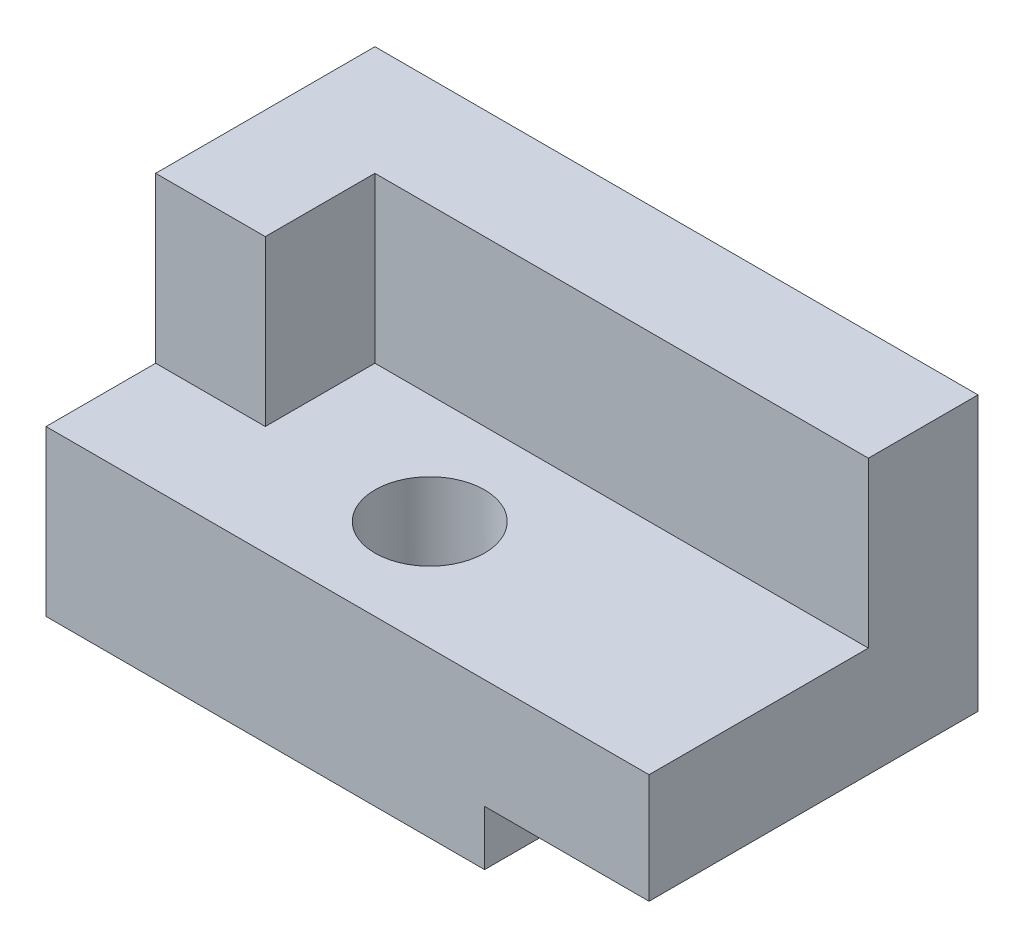
ISO-10303-21;
HEADER;
FILE_DESCRIPTION(('STEP AP214'),'2;1');
FILE_NAME('part.step','',(''),(''),'','','');
FILE_SCHEMA(('AUTOMOTIVE_DESIGN { 1 0 10303 214 1 1 1 1 }'));
ENDSEC;
DATA;
#1=APPLICATION_CONTEXT('core data for automotive mechanical design processes');
#2=APPLICATION_PROTOCOL_DEFINITION('international standard','automotive_design',2000,#1);
#3=PRODUCT_CONTEXT('',#1,'mechanical');
#4=PRODUCT('Part','Part','',(#3));
#5=PRODUCT_RELATED_PRODUCT_CATEGORY('part','',(#4));
#6=PRODUCT_DEFINITION_FORMATION('','',#4);
#7=PRODUCT_DEFINITION_CONTEXT('part definition',#1,'design');
#8=PRODUCT_DEFINITION('design','',#6,#7);
#9=PRODUCT_DEFINITION_SHAPE('','',#8);
#10=(LENGTH_UNIT() NAMED_UNIT(*) SI_UNIT(.MILLI.,.METRE.));
#11=(NAMED_UNIT(*) PLANE_ANGLE_UNIT() SI_UNIT($,.RADIAN.));
#12=(NAMED_UNIT(*) SI_UNIT($,.STERADIAN.) SOLID_ANGLE_UNIT());
#13=UNCERTAINTY_MEASURE_WITH_UNIT(LENGTH_MEASURE(1.E-05),#10,'distance_accuracy_value','');
#14=(GEOMETRIC_REPRESENTATION_CONTEXT(3) GLOBAL_UNCERTAINTY_ASSIGNED_CONTEXT((#13)) GLOBAL_UNIT_ASSIGNED_CONTEXT((#10,
#11,#12)) REPRESENTATION_CONTEXT('',''));
#15=CARTESIAN_POINT('',(0.,0.,0.));
#16=DIRECTION('',(0.,0.,1.));
#17=DIRECTION('',(1.,0.,0.));
#18=AXIS2_PLACEMENT_3D('',#15,#16,#17);
#19=CARTESIAN_POINT('',(88.9,25.4,-76.2));
#20=DIRECTION('',(0.,0.,-1.));
#21=DIRECTION('',(-1.,0.,0.));
#22=AXIS2_PLACEMENT_3D('',#19,#20,#21);
#23=PLANE('',#22);
#24=DIRECTION('',(0.,1.,0.));
#25=VECTOR('',#24,1.);
#26=CARTESIAN_POINT('',(228.6,25.4,-76.2));
#27=LINE('',#26,#25);
#28=CARTESIAN_POINT('',(228.6,38.1,-76.2));
#29=VERTEX_POINT('',#28);
#30=CARTESIAN_POINT('',(228.6,101.6,-76.2));
#31=VERTEX_POINT('',#30);
#32=EDGE_CURVE('E126',#29,#31,#27,.T.);
#33=ORIENTED_EDGE('',*,*,#32,.F.);
#34=DIRECTION('',(-1.,0.,0.));
#35=VECTOR('',#34,1.);
#36=CARTESIAN_POINT('',(88.9,38.1,-76.2));
#37=LINE('',#36,#35);
#38=CARTESIAN_POINT('',(190.5,38.1,-76.2));
#39=VERTEX_POINT('',#38);
#40=EDGE_CURVE('E116',#29,#39,#37,.T.);
#41=ORIENTED_EDGE('',*,*,#40,.T.);
#42=DIRECTION('',(0.,-1.,0.));
#43=VECTOR('',#42,1.);
#44=CARTESIAN_POINT('',(190.5,25.4,-76.2));
#45=LINE('',#44,#43);
#46=CARTESIAN_POINT('',(190.5,25.4,-76.2));
#47=VERTEX_POINT('',#46);
#48=EDGE_CURVE('E109',#39,#47,#45,.T.);
#49=ORIENTED_EDGE('',*,*,#48,.T.);
#50=DIRECTION('',(-1.,0.,0.));
#51=VECTOR('',#50,1.);
#52=CARTESIAN_POINT('',(88.9,25.4,-76.2));
#53=LINE('',#52,#51);
#54=CARTESIAN_POINT('',(88.9,25.4,-76.2));
#55=VERTEX_POINT('',#54);
#56=EDGE_CURVE('E158',#47,#55,#53,.T.);
#57=ORIENTED_EDGE('',*,*,#56,.T.);
#58=DIRECTION('',(0.,1.,0.));
#59=VECTOR('',#58,1.);
#60=CARTESIAN_POINT('',(88.9,25.4,-76.2));
#61=LINE('',#60,#59);
#62=CARTESIAN_POINT('',(88.9,101.6,-76.2));
#63=VERTEX_POINT('',#62);
#64=EDGE_CURVE('E163',#55,#63,#61,.T.);
#65=ORIENTED_EDGE('',*,*,#64,.T.);
#66=DIRECTION('',(-1.,0.,0.));
#67=VECTOR('',#66,1.);
#68=CARTESIAN_POINT('',(88.9,101.6,-76.2));
#69=LINE('',#68,#67);
#70=EDGE_CURVE('E156',#31,#63,#69,.T.);
#71=ORIENTED_EDGE('',*,*,#70,.F.);
#72=EDGE_LOOP('',(#33,#41,#49,#57,#65,#71));
#73=FACE_BOUND('',#72,.T.);
#74=ADVANCED_FACE('F34',(#73),#23,.T.);
#75=CARTESIAN_POINT('',(228.6,25.4,-76.2));
#76=DIRECTION('',(1.,0.,0.));
#77=DIRECTION('',(0.,0.,-1.));
#78=AXIS2_PLACEMENT_3D('',#75,#76,#77);
#79=PLANE('',#78);
#80=DIRECTION('',(0.,1.,0.));
#81=VECTOR('',#80,1.);
#82=CARTESIAN_POINT('',(228.6,25.4,0.));
#83=LINE('',#82,#81);
#84=CARTESIAN_POINT('',(228.6,38.1,0.));
#85=VERTEX_POINT('',#84);
#86=CARTESIAN_POINT('',(228.6,63.5,0.));
#87=VERTEX_POINT('',#86);
#88=EDGE_CURVE('E154',#85,#87,#83,.T.);
#89=ORIENTED_EDGE('',*,*,#88,.F.);
#90=DIRECTION('',(0.,0.,-1.));
#91=VECTOR('',#90,1.);
#92=CARTESIAN_POINT('',(228.6,38.1,284.042548332516));
#93=LINE('',#92,#91);
#94=EDGE_CURVE('E117',#85,#29,#93,.T.);
#95=ORIENTED_EDGE('',*,*,#94,.T.);
#96=ORIENTED_EDGE('',*,*,#32,.T.);
#97=DIRECTION('',(0.,0.,-1.));
#98=VECTOR('',#97,1.);
#99=CARTESIAN_POINT('',(228.6,101.6,-76.2));
#100=LINE('',#99,#98);
#101=CARTESIAN_POINT('',(228.6,101.6,-50.8));
#102=VERTEX_POINT('',#101);
#103=EDGE_CURVE('E161',#102,#31,#100,.T.);
#104=ORIENTED_EDGE('',*,*,#103,.F.);
#105=DIRECTION('',(0.,1.,0.));
#106=VECTOR('',#105,1.);
#107=CARTESIAN_POINT('',(228.6,25.4,-50.8));
#108=LINE('',#107,#106);
#109=CARTESIAN_POINT('',(228.6,63.5,-50.8));
#110=VERTEX_POINT('',#109);
#111=EDGE_CURVE('E181',#110,#102,#108,.T.);
#112=ORIENTED_EDGE('',*,*,#111,.F.);
#113=DIRECTION('',(0.,0.,-1.));
#114=VECTOR('',#113,1.);
#115=CARTESIAN_POINT('',(228.6,63.5,-50.8));
#116=LINE('',#115,#114);
#117=EDGE_CURVE('E139',#87,#110,#116,.T.);
#118=ORIENTED_EDGE('',*,*,#117,.F.);
#119=EDGE_LOOP('',(#89,#95,#96,#104,#112,#118));
#120=FACE_BOUND('',#119,.T.);
#121=ADVANCED_FACE('F201',(#120),#79,.T.);
#122=CARTESIAN_POINT('',(0.,25.4,0.));
#123=DIRECTION('',(0.,-1.,0.));
#124=DIRECTION('',(0.,0.,-1.));
#125=AXIS2_PLACEMENT_3D('',#122,#123,#124);
#126=PLANE('',#125);
#127=CARTESIAN_POINT('',(152.4,25.4,-25.4));
#128=DIRECTION('',(0.,1.,0.));
#129=DIRECTION('',(0.,0.,1.));
#130=AXIS2_PLACEMENT_3D('',#127,#128,#129);
#131=CIRCLE('',#130,12.7);
#132=CARTESIAN_POINT('',(152.4,25.4,-12.7));
#133=VERTEX_POINT('',#132);
#134=EDGE_CURVE('E127',#133,#133,#131,.T.);
#135=ORIENTED_EDGE('',*,*,#134,.T.);
#136=EDGE_LOOP('',(#135));
#137=FACE_BOUND('',#136,.T.);
#138=ORIENTED_EDGE('',*,*,#56,.F.);
#139=DIRECTION('',(0.,0.,-1.));
#140=VECTOR('',#139,1.);
#141=CARTESIAN_POINT('',(190.5,25.4,284.042548332516));
#142=LINE('',#141,#140);
#143=CARTESIAN_POINT('',(190.5,25.4,0.));
#144=VERTEX_POINT('',#143);
#145=EDGE_CURVE('E112',#144,#47,#142,.T.);
#146=ORIENTED_EDGE('',*,*,#145,.F.);
#147=DIRECTION('',(1.,0.,0.));
#148=VECTOR('',#147,1.);
#149=CARTESIAN_POINT('',(228.6,25.4,0.));
#150=LINE('',#149,#148);
#151=CARTESIAN_POINT('',(88.9,25.4,0.));
#152=VERTEX_POINT('',#151);
#153=EDGE_CURVE('E134',#152,#144,#150,.T.);
#154=ORIENTED_EDGE('',*,*,#153,.F.);
#155=DIRECTION('',(0.,0.,1.));
#156=VECTOR('',#155,1.);
#157=CARTESIAN_POINT('',(88.9,25.4,-25.4));
#158=LINE('',#157,#156);
#159=EDGE_CURVE('E160',#55,#152,#158,.T.);
#160=ORIENTED_EDGE('',*,*,#159,.F.);
#161=EDGE_LOOP('',(#138,#146,#154,#160));
#162=FACE_BOUND('',#161,.T.);
#163=ADVANCED_FACE('F197',(#137,#162),#126,.T.);
#164=CARTESIAN_POINT('',(228.6,25.4,0.));
#165=DIRECTION('',(0.,0.,1.));
#166=DIRECTION('',(1.,0.,0.));
#167=AXIS2_PLACEMENT_3D('',#164,#165,#166);
#168=PLANE('',#167);
#169=DIRECTION('',(0.,1.,0.));
#170=VECTOR('',#169,1.);
#171=CARTESIAN_POINT('',(190.5,25.4,0.));
#172=LINE('',#171,#170);
#173=CARTESIAN_POINT('',(190.5,38.1,0.));
#174=VERTEX_POINT('',#173);
#175=EDGE_CURVE('E41',#144,#174,#172,.T.);
#176=ORIENTED_EDGE('',*,*,#175,.T.);
#177=DIRECTION('',(1.,0.,0.));
#178=VECTOR('',#177,1.);
#179=CARTESIAN_POINT('',(228.6,38.1,0.));
#180=LINE('',#179,#178);
#181=EDGE_CURVE('E11',#174,#85,#180,.T.);
#182=ORIENTED_EDGE('',*,*,#181,.T.);
#183=ORIENTED_EDGE('',*,*,#88,.T.);
#184=DIRECTION('',(1.,0.,0.));
#185=VECTOR('',#184,1.);
#186=CARTESIAN_POINT('',(228.6,63.5,0.));
#187=LINE('',#186,#185);
#188=CARTESIAN_POINT('',(88.9,63.5,0.));
#189=VERTEX_POINT('',#188);
#190=EDGE_CURVE('E138',#189,#87,#187,.T.);
#191=ORIENTED_EDGE('',*,*,#190,.F.);
#192=DIRECTION('',(0.,1.,0.));
#193=VECTOR('',#192,1.);
#194=CARTESIAN_POINT('',(88.9,25.4,0.));
#195=LINE('',#194,#193);
#196=EDGE_CURVE('E137',#152,#189,#195,.T.);
#197=ORIENTED_EDGE('',*,*,#196,.F.);
#198=ORIENTED_EDGE('',*,*,#153,.T.);
#199=EDGE_LOOP('',(#176,#182,#183,#191,#197,#198));
#200=FACE_BOUND('',#199,.T.);
#201=ADVANCED_FACE('F192',(#200),#168,.T.);
#202=CARTESIAN_POINT('',(228.6,25.4,-50.8));
#203=DIRECTION('',(0.,0.,1.));
#204=DIRECTION('',(1.,0.,0.));
#205=AXIS2_PLACEMENT_3D('',#202,#203,#204);
#206=PLANE('',#205);
#207=DIRECTION('',(0.,1.,0.));
#208=VECTOR('',#207,1.);
#209=CARTESIAN_POINT('',(114.3,25.4,-50.8));
#210=LINE('',#209,#208);
#211=CARTESIAN_POINT('',(114.3,63.5,-50.8));
#212=VERTEX_POINT('',#211);
#213=CARTESIAN_POINT('',(114.3,101.6,-50.8));
#214=VERTEX_POINT('',#213);
#215=EDGE_CURVE('E183',#212,#214,#210,.T.);
#216=ORIENTED_EDGE('',*,*,#215,.F.);
#217=DIRECTION('',(-1.,0.,0.));
#218=VECTOR('',#217,1.);
#219=CARTESIAN_POINT('',(228.6,63.5,-50.8));
#220=LINE('',#219,#218);
#221=EDGE_CURVE('E56',#110,#212,#220,.T.);
#222=ORIENTED_EDGE('',*,*,#221,.F.);
#223=ORIENTED_EDGE('',*,*,#111,.T.);
#224=DIRECTION('',(1.,0.,0.));
#225=VECTOR('',#224,1.);
#226=CARTESIAN_POINT('',(228.6,101.6,-50.8));
#227=LINE('',#226,#225);
#228=EDGE_CURVE('E175',#214,#102,#227,.T.);
#229=ORIENTED_EDGE('',*,*,#228,.F.);
#230=EDGE_LOOP('',(#216,#222,#223,#229));
#231=FACE_BOUND('',#230,.T.);
#232=ADVANCED_FACE('F216',(#231),#206,.T.);
#233=CARTESIAN_POINT('',(114.3,25.4,-25.4));
#234=DIRECTION('',(1.,0.,0.));
#235=DIRECTION('',(0.,0.,-1.));
#236=AXIS2_PLACEMENT_3D('',#233,#234,#235);
#237=PLANE('',#236);
#238=DIRECTION('',(0.,1.,0.));
#239=VECTOR('',#238,1.);
#240=CARTESIAN_POINT('',(114.3,25.4,-25.4));
#241=LINE('',#240,#239);
#242=CARTESIAN_POINT('',(114.3,63.5,-25.4));
#243=VERTEX_POINT('',#242);
#244=CARTESIAN_POINT('',(114.3,101.6,-25.4));
#245=VERTEX_POINT('',#244);
#246=EDGE_CURVE('E185',#243,#245,#241,.T.);
#247=ORIENTED_EDGE('',*,*,#246,.F.);
#248=DIRECTION('',(0.,0.,1.));
#249=VECTOR('',#248,1.);
#250=CARTESIAN_POINT('',(114.3,63.5,-25.4));
#251=LINE('',#250,#249);
#252=EDGE_CURVE('E143',#212,#243,#251,.T.);
#253=ORIENTED_EDGE('',*,*,#252,.F.);
#254=ORIENTED_EDGE('',*,*,#215,.T.);
#255=DIRECTION('',(0.,0.,-1.));
#256=VECTOR('',#255,1.);
#257=CARTESIAN_POINT('',(114.3,101.6,-25.4));
#258=LINE('',#257,#256);
#259=EDGE_CURVE('E172',#245,#214,#258,.T.);
#260=ORIENTED_EDGE('',*,*,#259,.F.);
#261=EDGE_LOOP('',(#247,#253,#254,#260));
#262=FACE_BOUND('',#261,.T.);
#263=ADVANCED_FACE('F220',(#262),#237,.T.);
#264=CARTESIAN_POINT('',(114.3,25.4,-25.4));
#265=DIRECTION('',(0.,0.,1.));
#266=DIRECTION('',(1.,0.,0.));
#267=AXIS2_PLACEMENT_3D('',#264,#265,#266);
#268=PLANE('',#267);
#269=DIRECTION('',(0.,1.,0.));
#270=VECTOR('',#269,1.);
#271=CARTESIAN_POINT('',(88.9,25.4,-25.4));
#272=LINE('',#271,#270);
#273=CARTESIAN_POINT('',(88.9,63.5,-25.4));
#274=VERTEX_POINT('',#273);
#275=CARTESIAN_POINT('',(88.9,101.6,-25.4));
#276=VERTEX_POINT('',#275);
#277=EDGE_CURVE('E187',#274,#276,#272,.T.);
#278=ORIENTED_EDGE('',*,*,#277,.F.);
#279=DIRECTION('',(-1.,0.,0.));
#280=VECTOR('',#279,1.);
#281=CARTESIAN_POINT('',(114.3,63.5,-25.4));
#282=LINE('',#281,#280);
#283=EDGE_CURVE('E146',#243,#274,#282,.T.);
#284=ORIENTED_EDGE('',*,*,#283,.F.);
#285=ORIENTED_EDGE('',*,*,#246,.T.);
#286=DIRECTION('',(1.,0.,0.));
#287=VECTOR('',#286,1.);
#288=CARTESIAN_POINT('',(114.3,101.6,-25.4));
#289=LINE('',#288,#287);
#290=EDGE_CURVE('E169',#276,#245,#289,.T.);
#291=ORIENTED_EDGE('',*,*,#290,.F.);
#292=EDGE_LOOP('',(#278,#284,#285,#291));
#293=FACE_BOUND('',#292,.T.);
#294=ADVANCED_FACE('F222',(#293),#268,.T.);
#295=CARTESIAN_POINT('',(88.9,25.4,-25.4));
#296=DIRECTION('',(-1.,0.,0.));
#297=DIRECTION('',(0.,0.,1.));
#298=AXIS2_PLACEMENT_3D('',#295,#296,#297);
#299=PLANE('',#298);
#300=DIRECTION('',(0.,0.,1.));
#301=VECTOR('',#300,1.);
#302=CARTESIAN_POINT('',(88.9,101.6,-25.4));
#303=LINE('',#302,#301);
#304=EDGE_CURVE('E166',#63,#276,#303,.T.);
#305=ORIENTED_EDGE('',*,*,#304,.F.);
#306=ORIENTED_EDGE('',*,*,#64,.F.);
#307=ORIENTED_EDGE('',*,*,#159,.T.);
#308=ORIENTED_EDGE('',*,*,#196,.T.);
#309=DIRECTION('',(0.,0.,1.));
#310=VECTOR('',#309,1.);
#311=CARTESIAN_POINT('',(88.9,63.5,0.));
#312=LINE('',#311,#310);
#313=EDGE_CURVE('E149',#274,#189,#312,.T.);
#314=ORIENTED_EDGE('',*,*,#313,.F.);
#315=ORIENTED_EDGE('',*,*,#277,.T.);
#316=EDGE_LOOP('',(#305,#306,#307,#308,#314,#315));
#317=FACE_BOUND('',#316,.T.);
#318=ADVANCED_FACE('F210',(#317),#299,.T.);
#319=CARTESIAN_POINT('',(0.,101.6,0.));
#320=DIRECTION('',(0.,-1.,0.));
#321=DIRECTION('',(0.,0.,-1.));
#322=AXIS2_PLACEMENT_3D('',#319,#320,#321);
#323=PLANE('',#322);
#324=ORIENTED_EDGE('',*,*,#70,.T.);
#325=ORIENTED_EDGE('',*,*,#304,.T.);
#326=ORIENTED_EDGE('',*,*,#290,.T.);
#327=ORIENTED_EDGE('',*,*,#259,.T.);
#328=ORIENTED_EDGE('',*,*,#228,.T.);
#329=ORIENTED_EDGE('',*,*,#103,.T.);
#330=EDGE_LOOP('',(#324,#325,#326,#327,#328,#329));
#331=FACE_BOUND('',#330,.T.);
#332=ADVANCED_FACE('F214',(#331),#323,.F.);
#333=CARTESIAN_POINT('',(0.,63.5,0.));
#334=DIRECTION('',(0.,-1.,0.));
#335=DIRECTION('',(0.,0.,-1.));
#336=AXIS2_PLACEMENT_3D('',#333,#334,#335);
#337=PLANE('',#336);
#338=CARTESIAN_POINT('',(152.4,63.5,-25.4));
#339=DIRECTION('',(0.,-1.,0.));
#340=DIRECTION('',(0.,0.,-1.));
#341=AXIS2_PLACEMENT_3D('',#338,#339,#340);
#342=CIRCLE('',#341,12.7);
#343=CARTESIAN_POINT('',(152.4,63.5,-38.1));
#344=VERTEX_POINT('',#343);
#345=EDGE_CURVE('E130',#344,#344,#342,.T.);
#346=ORIENTED_EDGE('',*,*,#345,.T.);
#347=EDGE_LOOP('',(#346));
#348=FACE_BOUND('',#347,.T.);
#349=ORIENTED_EDGE('',*,*,#117,.T.);
#350=ORIENTED_EDGE('',*,*,#221,.T.);
#351=ORIENTED_EDGE('',*,*,#252,.T.);
#352=ORIENTED_EDGE('',*,*,#283,.T.);
#353=ORIENTED_EDGE('',*,*,#313,.T.);
#354=ORIENTED_EDGE('',*,*,#190,.T.);
#355=EDGE_LOOP('',(#349,#350,#351,#352,#353,#354));
#356=FACE_BOUND('',#355,.T.);
#357=ADVANCED_FACE('F206',(#348,#356),#337,.F.);
#358=CARTESIAN_POINT('',(152.4,25.4,-25.4));
#359=DIRECTION('',(0.,1.,0.));
#360=DIRECTION('',(0.,0.,1.));
#361=AXIS2_PLACEMENT_3D('',#358,#359,#360);
#362=CYLINDRICAL_SURFACE('',#361,12.7);
#363=ORIENTED_EDGE('',*,*,#134,.F.);
#364=EDGE_LOOP('',(#363));
#365=FACE_BOUND('',#364,.T.);
#366=ORIENTED_EDGE('',*,*,#345,.F.);
#367=EDGE_LOOP('',(#366));
#368=FACE_BOUND('',#367,.T.);
#369=ADVANCED_FACE('F252',(#365,#368),#362,.F.);
#370=CARTESIAN_POINT('',(228.6,38.1,284.042548332516));
#371=DIRECTION('',(0.,-1.,0.));
#372=DIRECTION('',(0.,0.,-1.));
#373=AXIS2_PLACEMENT_3D('',#370,#371,#372);
#374=PLANE('',#373);
#375=ORIENTED_EDGE('',*,*,#40,.F.);
#376=ORIENTED_EDGE('',*,*,#94,.F.);
#377=ORIENTED_EDGE('',*,*,#181,.F.);
#378=DIRECTION('',(0.,0.,-1.));
#379=VECTOR('',#378,1.);
#380=CARTESIAN_POINT('',(190.5,38.1,284.042548332516));
#381=LINE('',#380,#379);
#382=EDGE_CURVE('E48',#174,#39,#381,.T.);
#383=ORIENTED_EDGE('',*,*,#382,.T.);
#384=EDGE_LOOP('',(#375,#376,#377,#383));
#385=FACE_BOUND('',#384,.T.);
#386=ADVANCED_FACE('F120',(#385),#374,.T.);
#387=CARTESIAN_POINT('',(190.5,38.1,284.042548332516));
#388=DIRECTION('',(1.,0.,0.));
#389=DIRECTION('',(0.,0.,-1.));
#390=AXIS2_PLACEMENT_3D('',#387,#388,#389);
#391=PLANE('',#390);
#392=ORIENTED_EDGE('',*,*,#48,.F.);
#393=ORIENTED_EDGE('',*,*,#382,.F.);
#394=ORIENTED_EDGE('',*,*,#175,.F.);
#395=ORIENTED_EDGE('',*,*,#145,.T.);
#396=EDGE_LOOP('',(#392,#393,#394,#395));
#397=FACE_BOUND('',#396,.T.);
#398=ADVANCED_FACE('F110',(#397),#391,.T.);
#399=CLOSED_SHELL('',(#74,#121,#163,#201,#232,#263,#294,#318,#332,#357,#369,#386,#398));
#400=MANIFOLD_SOLID_BREP('B2',#399);
#401=ADVANCED_BREP_SHAPE_REPRESENTATION('',(#18,#400),#14);
#402=SHAPE_DEFINITION_REPRESENTATION(#9,#401);
ENDSEC;
END-ISO-10303-21;
